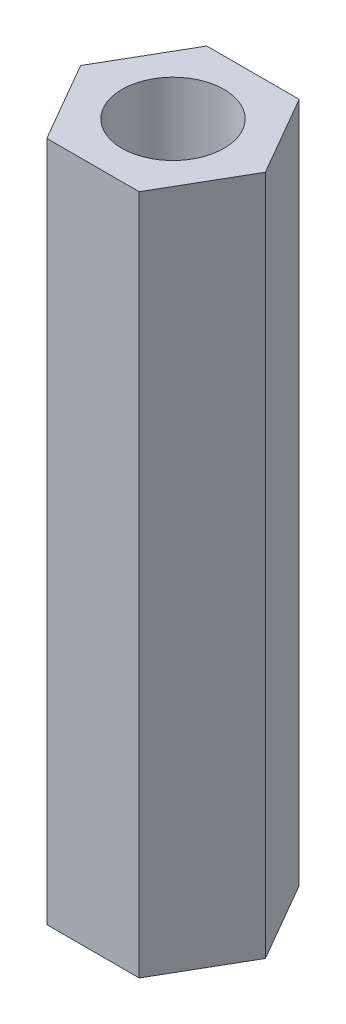
ISO-10303-21;
HEADER;
FILE_DESCRIPTION(('STEP AP214'),'2;1');
FILE_NAME('part.step','',(''),(''),'','','');
FILE_SCHEMA(('AUTOMOTIVE_DESIGN { 1 0 10303 214 1 1 1 1 }'));
ENDSEC;
DATA;
#1=APPLICATION_CONTEXT('core data for automotive mechanical design processes');
#2=APPLICATION_PROTOCOL_DEFINITION('international standard','automotive_design',2000,#1);
#3=PRODUCT_CONTEXT('',#1,'mechanical');
#4=PRODUCT('Part','Part','',(#3));
#5=PRODUCT_RELATED_PRODUCT_CATEGORY('part','',(#4));
#6=PRODUCT_DEFINITION_FORMATION('','',#4);
#7=PRODUCT_DEFINITION_CONTEXT('part definition',#1,'design');
#8=PRODUCT_DEFINITION('design','',#6,#7);
#9=PRODUCT_DEFINITION_SHAPE('','',#8);
#10=(LENGTH_UNIT() NAMED_UNIT(*) SI_UNIT(.MILLI.,.METRE.));
#11=(NAMED_UNIT(*) PLANE_ANGLE_UNIT() SI_UNIT($,.RADIAN.));
#12=(NAMED_UNIT(*) SI_UNIT($,.STERADIAN.) SOLID_ANGLE_UNIT());
#13=UNCERTAINTY_MEASURE_WITH_UNIT(LENGTH_MEASURE(1.E-05),#10,'distance_accuracy_value','');
#14=(GEOMETRIC_REPRESENTATION_CONTEXT(3) GLOBAL_UNCERTAINTY_ASSIGNED_CONTEXT((#13)) GLOBAL_UNIT_ASSIGNED_CONTEXT((#10,
#11,#12)) REPRESENTATION_CONTEXT('',''));
#15=CARTESIAN_POINT('',(0.,0.,0.));
#16=DIRECTION('',(0.,0.,1.));
#17=DIRECTION('',(1.,0.,0.));
#18=AXIS2_PLACEMENT_3D('',#15,#16,#17);
#19=CARTESIAN_POINT('',(0.,20.,0.));
#20=DIRECTION('',(0.,1.,0.));
#21=DIRECTION('',(0.,0.,1.));
#22=AXIS2_PLACEMENT_3D('',#19,#20,#21);
#23=PLANE('',#22);
#24=DIRECTION('',(0.5,0.,-0.866025403784439));
#25=VECTOR('',#24,1.);
#26=CARTESIAN_POINT('',(1.35677313259562,20.,2.35));
#27=LINE('',#26,#25);
#28=CARTESIAN_POINT('',(1.35677313259562,20.,2.35));
#29=VERTEX_POINT('',#28);
#30=CARTESIAN_POINT('',(2.71354626519124,20.,0.));
#31=VERTEX_POINT('',#30);
#32=EDGE_CURVE('E130',#29,#31,#27,.T.);
#33=ORIENTED_EDGE('',*,*,#32,.T.);
#34=DIRECTION('',(-0.5,0.,-0.866025403784439));
#35=VECTOR('',#34,1.);
#36=CARTESIAN_POINT('',(2.71354626519124,20.,0.));
#37=LINE('',#36,#35);
#38=CARTESIAN_POINT('',(1.35677313259562,20.,-2.35));
#39=VERTEX_POINT('',#38);
#40=EDGE_CURVE('E88',#31,#39,#37,.T.);
#41=ORIENTED_EDGE('',*,*,#40,.T.);
#42=DIRECTION('',(-1.,0.,0.));
#43=VECTOR('',#42,1.);
#44=CARTESIAN_POINT('',(1.35677313259562,20.,-2.35));
#45=LINE('',#44,#43);
#46=CARTESIAN_POINT('',(-1.35677313259562,20.,-2.35));
#47=VERTEX_POINT('',#46);
#48=EDGE_CURVE('E101',#39,#47,#45,.T.);
#49=ORIENTED_EDGE('',*,*,#48,.T.);
#50=DIRECTION('',(-0.5,0.,0.866025403784439));
#51=VECTOR('',#50,1.);
#52=CARTESIAN_POINT('',(-1.35677313259562,20.,-2.35));
#53=LINE('',#52,#51);
#54=CARTESIAN_POINT('',(-2.71354626519124,20.,0.));
#55=VERTEX_POINT('',#54);
#56=EDGE_CURVE('E95',#47,#55,#53,.T.);
#57=ORIENTED_EDGE('',*,*,#56,.T.);
#58=DIRECTION('',(0.5,0.,0.866025403784439));
#59=VECTOR('',#58,1.);
#60=CARTESIAN_POINT('',(-2.71354626519124,20.,0.));
#61=LINE('',#60,#59);
#62=CARTESIAN_POINT('',(-1.35677313259562,20.,2.35));
#63=VERTEX_POINT('',#62);
#64=EDGE_CURVE('E99',#55,#63,#61,.T.);
#65=ORIENTED_EDGE('',*,*,#64,.T.);
#66=DIRECTION('',(1.,0.,0.));
#67=VECTOR('',#66,1.);
#68=CARTESIAN_POINT('',(-1.35677313259562,20.,2.35));
#69=LINE('',#68,#67);
#70=EDGE_CURVE('E51',#63,#29,#69,.T.);
#71=ORIENTED_EDGE('',*,*,#70,.T.);
#72=EDGE_LOOP('',(#33,#41,#49,#57,#65,#71));
#73=FACE_BOUND('',#72,.T.);
#74=CARTESIAN_POINT('',(0.,20.,0.));
#75=DIRECTION('',(0.,1.,0.));
#76=DIRECTION('',(0.,0.,1.));
#77=AXIS2_PLACEMENT_3D('',#74,#75,#76);
#78=CIRCLE('',#77,1.5);
#79=CARTESIAN_POINT('',(0.,20.,1.5));
#80=VERTEX_POINT('',#79);
#81=EDGE_CURVE('E123',#80,#80,#78,.T.);
#82=ORIENTED_EDGE('',*,*,#81,.F.);
#83=EDGE_LOOP('',(#82));
#84=FACE_BOUND('',#83,.T.);
#85=ADVANCED_FACE('F34',(#73,#84),#23,.T.);
#86=CARTESIAN_POINT('',(0.,0.,0.));
#87=DIRECTION('',(0.,1.,0.));
#88=DIRECTION('',(0.,0.,1.));
#89=AXIS2_PLACEMENT_3D('',#86,#87,#88);
#90=PLANE('',#89);
#91=DIRECTION('',(0.5,0.,-0.866025403784439));
#92=VECTOR('',#91,1.);
#93=CARTESIAN_POINT('',(1.35677313259562,0.,2.35));
#94=LINE('',#93,#92);
#95=CARTESIAN_POINT('',(1.35677313259562,0.,2.35));
#96=VERTEX_POINT('',#95);
#97=CARTESIAN_POINT('',(2.71354626519124,0.,0.));
#98=VERTEX_POINT('',#97);
#99=EDGE_CURVE('E119',#96,#98,#94,.T.);
#100=ORIENTED_EDGE('',*,*,#99,.F.);
#101=DIRECTION('',(1.,0.,0.));
#102=VECTOR('',#101,1.);
#103=CARTESIAN_POINT('',(-1.35677313259562,0.,2.35));
#104=LINE('',#103,#102);
#105=CARTESIAN_POINT('',(-1.35677313259562,0.,2.35));
#106=VERTEX_POINT('',#105);
#107=EDGE_CURVE('E80',#106,#96,#104,.T.);
#108=ORIENTED_EDGE('',*,*,#107,.F.);
#109=DIRECTION('',(0.5,0.,0.866025403784439));
#110=VECTOR('',#109,1.);
#111=CARTESIAN_POINT('',(-2.71354626519124,0.,0.));
#112=LINE('',#111,#110);
#113=CARTESIAN_POINT('',(-2.71354626519124,0.,0.));
#114=VERTEX_POINT('',#113);
#115=EDGE_CURVE('E74',#114,#106,#112,.T.);
#116=ORIENTED_EDGE('',*,*,#115,.F.);
#117=DIRECTION('',(-0.5,0.,0.866025403784439));
#118=VECTOR('',#117,1.);
#119=CARTESIAN_POINT('',(-1.35677313259562,0.,-2.35));
#120=LINE('',#119,#118);
#121=CARTESIAN_POINT('',(-1.35677313259562,0.,-2.35));
#122=VERTEX_POINT('',#121);
#123=EDGE_CURVE('E109',#122,#114,#120,.T.);
#124=ORIENTED_EDGE('',*,*,#123,.F.);
#125=DIRECTION('',(-1.,0.,0.));
#126=VECTOR('',#125,1.);
#127=CARTESIAN_POINT('',(1.35677313259562,0.,-2.35));
#128=LINE('',#127,#126);
#129=CARTESIAN_POINT('',(1.35677313259562,0.,-2.35));
#130=VERTEX_POINT('',#129);
#131=EDGE_CURVE('E125',#130,#122,#128,.T.);
#132=ORIENTED_EDGE('',*,*,#131,.F.);
#133=DIRECTION('',(-0.5,0.,-0.866025403784439));
#134=VECTOR('',#133,1.);
#135=CARTESIAN_POINT('',(2.71354626519124,0.,0.));
#136=LINE('',#135,#134);
#137=EDGE_CURVE('E122',#98,#130,#136,.T.);
#138=ORIENTED_EDGE('',*,*,#137,.F.);
#139=EDGE_LOOP('',(#100,#108,#116,#124,#132,#138));
#140=FACE_BOUND('',#139,.T.);
#141=CARTESIAN_POINT('',(0.,0.,0.));
#142=DIRECTION('',(0.,1.,0.));
#143=DIRECTION('',(0.,0.,1.));
#144=AXIS2_PLACEMENT_3D('',#141,#142,#143);
#145=CIRCLE('',#144,1.5);
#146=CARTESIAN_POINT('',(0.,0.,1.5));
#147=VERTEX_POINT('',#146);
#148=EDGE_CURVE('E223',#147,#147,#145,.T.);
#149=ORIENTED_EDGE('',*,*,#148,.T.);
#150=EDGE_LOOP('',(#149));
#151=FACE_BOUND('',#150,.T.);
#152=ADVANCED_FACE('F139',(#140,#151),#90,.F.);
#153=CARTESIAN_POINT('',(1.35677313259562,20.,2.35));
#154=DIRECTION('',(-0.866025403784439,0.,-0.5));
#155=DIRECTION('',(-0.5,0.,0.866025403784439));
#156=AXIS2_PLACEMENT_3D('',#153,#154,#155);
#157=PLANE('',#156);
#158=ORIENTED_EDGE('',*,*,#99,.T.);
#159=DIRECTION('',(0.,-1.,0.));
#160=VECTOR('',#159,1.);
#161=CARTESIAN_POINT('',(2.71354626519124,20.,0.));
#162=LINE('',#161,#160);
#163=EDGE_CURVE('E11',#31,#98,#162,.T.);
#164=ORIENTED_EDGE('',*,*,#163,.F.);
#165=ORIENTED_EDGE('',*,*,#32,.F.);
#166=DIRECTION('',(0.,-1.,0.));
#167=VECTOR('',#166,1.);
#168=CARTESIAN_POINT('',(1.35677313259562,20.,2.35));
#169=LINE('',#168,#167);
#170=EDGE_CURVE('E115',#29,#96,#169,.T.);
#171=ORIENTED_EDGE('',*,*,#170,.T.);
#172=EDGE_LOOP('',(#158,#164,#165,#171));
#173=FACE_BOUND('',#172,.T.);
#174=ADVANCED_FACE('F36',(#173),#157,.F.);
#175=CARTESIAN_POINT('',(2.71354626519124,20.,0.));
#176=DIRECTION('',(-0.866025403784439,0.,0.5));
#177=DIRECTION('',(0.5,0.,0.866025403784439));
#178=AXIS2_PLACEMENT_3D('',#175,#176,#177);
#179=PLANE('',#178);
#180=ORIENTED_EDGE('',*,*,#137,.T.);
#181=DIRECTION('',(0.,-1.,0.));
#182=VECTOR('',#181,1.);
#183=CARTESIAN_POINT('',(1.35677313259562,20.,-2.35));
#184=LINE('',#183,#182);
#185=EDGE_CURVE('E43',#39,#130,#184,.T.);
#186=ORIENTED_EDGE('',*,*,#185,.F.);
#187=ORIENTED_EDGE('',*,*,#40,.F.);
#188=ORIENTED_EDGE('',*,*,#163,.T.);
#189=EDGE_LOOP('',(#180,#186,#187,#188));
#190=FACE_BOUND('',#189,.T.);
#191=ADVANCED_FACE('F164',(#190),#179,.F.);
#192=CARTESIAN_POINT('',(1.35677313259562,20.,-2.35));
#193=DIRECTION('',(0.,0.,1.));
#194=DIRECTION('',(1.,0.,0.));
#195=AXIS2_PLACEMENT_3D('',#192,#193,#194);
#196=PLANE('',#195);
#197=ORIENTED_EDGE('',*,*,#131,.T.);
#198=DIRECTION('',(0.,-1.,0.));
#199=VECTOR('',#198,1.);
#200=CARTESIAN_POINT('',(-1.35677313259562,20.,-2.35));
#201=LINE('',#200,#199);
#202=EDGE_CURVE('E110',#47,#122,#201,.T.);
#203=ORIENTED_EDGE('',*,*,#202,.F.);
#204=ORIENTED_EDGE('',*,*,#48,.F.);
#205=ORIENTED_EDGE('',*,*,#185,.T.);
#206=EDGE_LOOP('',(#197,#203,#204,#205));
#207=FACE_BOUND('',#206,.T.);
#208=ADVANCED_FACE('F136',(#207),#196,.F.);
#209=CARTESIAN_POINT('',(-1.35677313259562,20.,-2.35));
#210=DIRECTION('',(0.866025403784439,0.,0.5));
#211=DIRECTION('',(0.5,0.,-0.866025403784439));
#212=AXIS2_PLACEMENT_3D('',#209,#210,#211);
#213=PLANE('',#212);
#214=ORIENTED_EDGE('',*,*,#123,.T.);
#215=DIRECTION('',(0.,-1.,0.));
#216=VECTOR('',#215,1.);
#217=CARTESIAN_POINT('',(-2.71354626519124,20.,0.));
#218=LINE('',#217,#216);
#219=EDGE_CURVE('E106',#55,#114,#218,.T.);
#220=ORIENTED_EDGE('',*,*,#219,.F.);
#221=ORIENTED_EDGE('',*,*,#56,.F.);
#222=ORIENTED_EDGE('',*,*,#202,.T.);
#223=EDGE_LOOP('',(#214,#220,#221,#222));
#224=FACE_BOUND('',#223,.T.);
#225=ADVANCED_FACE('F107',(#224),#213,.F.);
#226=CARTESIAN_POINT('',(-2.71354626519124,20.,0.));
#227=DIRECTION('',(0.866025403784439,0.,-0.5));
#228=DIRECTION('',(-0.5,0.,-0.866025403784439));
#229=AXIS2_PLACEMENT_3D('',#226,#227,#228);
#230=PLANE('',#229);
#231=ORIENTED_EDGE('',*,*,#115,.T.);
#232=DIRECTION('',(0.,-1.,0.));
#233=VECTOR('',#232,1.);
#234=CARTESIAN_POINT('',(-1.35677313259562,20.,2.35));
#235=LINE('',#234,#233);
#236=EDGE_CURVE('E111',#63,#106,#235,.T.);
#237=ORIENTED_EDGE('',*,*,#236,.F.);
#238=ORIENTED_EDGE('',*,*,#64,.F.);
#239=ORIENTED_EDGE('',*,*,#219,.T.);
#240=EDGE_LOOP('',(#231,#237,#238,#239));
#241=FACE_BOUND('',#240,.T.);
#242=ADVANCED_FACE('F113',(#241),#230,.F.);
#243=CARTESIAN_POINT('',(-1.35677313259562,20.,2.35));
#244=DIRECTION('',(0.,0.,-1.));
#245=DIRECTION('',(-1.,0.,0.));
#246=AXIS2_PLACEMENT_3D('',#243,#244,#245);
#247=PLANE('',#246);
#248=ORIENTED_EDGE('',*,*,#107,.T.);
#249=ORIENTED_EDGE('',*,*,#170,.F.);
#250=ORIENTED_EDGE('',*,*,#70,.F.);
#251=ORIENTED_EDGE('',*,*,#236,.T.);
#252=EDGE_LOOP('',(#248,#249,#250,#251));
#253=FACE_BOUND('',#252,.T.);
#254=ADVANCED_FACE('F144',(#253),#247,.F.);
#255=CARTESIAN_POINT('',(0.,20.,0.));
#256=DIRECTION('',(0.,-1.,0.));
#257=DIRECTION('',(0.,0.,-1.));
#258=AXIS2_PLACEMENT_3D('',#255,#256,#257);
#259=CYLINDRICAL_SURFACE('',#258,1.5);
#260=ORIENTED_EDGE('',*,*,#81,.T.);
#261=EDGE_LOOP('',(#260));
#262=FACE_BOUND('',#261,.T.);
#263=ORIENTED_EDGE('',*,*,#148,.F.);
#264=EDGE_LOOP('',(#263));
#265=FACE_BOUND('',#264,.T.);
#266=ADVANCED_FACE('F146',(#262,#265),#259,.F.);
#267=CLOSED_SHELL('',(#85,#152,#174,#191,#208,#225,#242,#254,#266));
#268=MANIFOLD_SOLID_BREP('B2',#267);
#269=ADVANCED_BREP_SHAPE_REPRESENTATION('',(#18,#268),#14);
#270=SHAPE_DEFINITION_REPRESENTATION(#9,#269);
ENDSEC;
END-ISO-10303-21;
